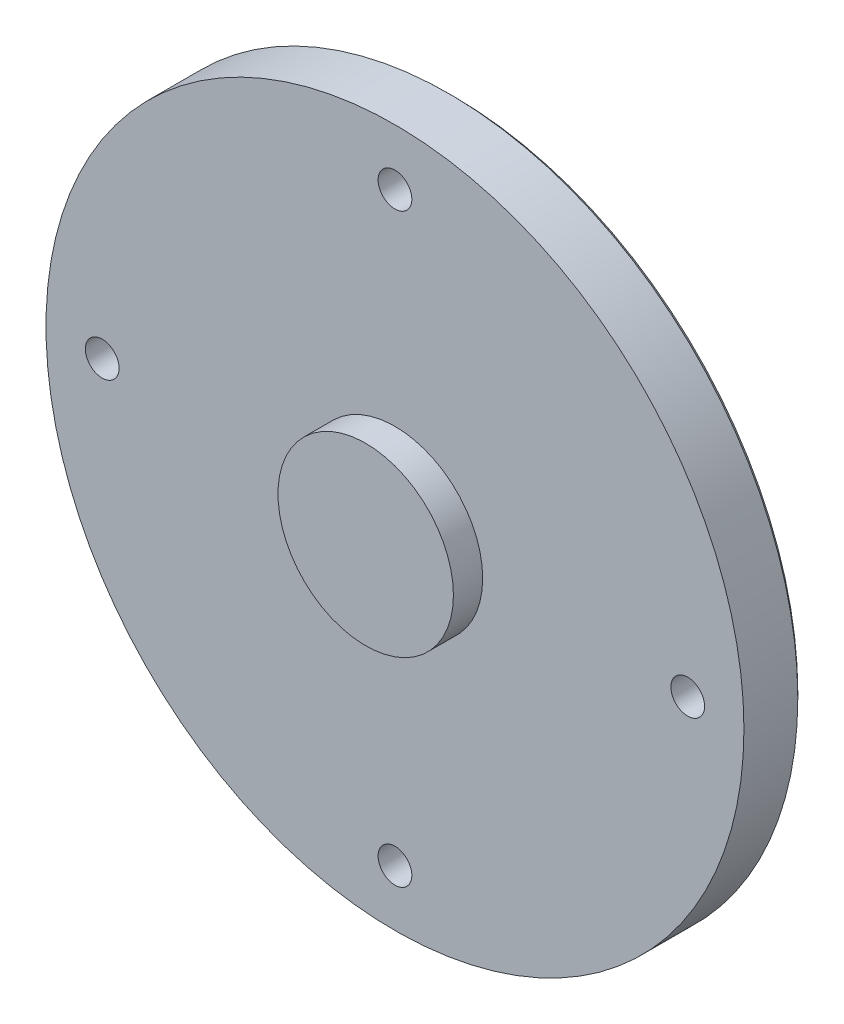
ISO-10303-21;
HEADER;
FILE_DESCRIPTION(('STEP AP214'),'2;1');
FILE_NAME('part.step','',(''),(''),'','','');
FILE_SCHEMA(('AUTOMOTIVE_DESIGN { 1 0 10303 214 1 1 1 1 }'));
ENDSEC;
DATA;
#1=APPLICATION_CONTEXT('core data for automotive mechanical design processes');
#2=APPLICATION_PROTOCOL_DEFINITION('international standard','automotive_design',2000,#1);
#3=PRODUCT_CONTEXT('',#1,'mechanical');
#4=PRODUCT('Part','Part','',(#3));
#5=PRODUCT_RELATED_PRODUCT_CATEGORY('part','',(#4));
#6=PRODUCT_DEFINITION_FORMATION('','',#4);
#7=PRODUCT_DEFINITION_CONTEXT('part definition',#1,'design');
#8=PRODUCT_DEFINITION('design','',#6,#7);
#9=PRODUCT_DEFINITION_SHAPE('','',#8);
#10=(LENGTH_UNIT() NAMED_UNIT(*) SI_UNIT(.MILLI.,.METRE.));
#11=(NAMED_UNIT(*) PLANE_ANGLE_UNIT() SI_UNIT($,.RADIAN.));
#12=(NAMED_UNIT(*) SI_UNIT($,.STERADIAN.) SOLID_ANGLE_UNIT());
#13=UNCERTAINTY_MEASURE_WITH_UNIT(LENGTH_MEASURE(1.E-05),#10,'distance_accuracy_value','');
#14=(GEOMETRIC_REPRESENTATION_CONTEXT(3) GLOBAL_UNCERTAINTY_ASSIGNED_CONTEXT((#13)) GLOBAL_UNIT_ASSIGNED_CONTEXT((#10,
#11,#12)) REPRESENTATION_CONTEXT('',''));
#15=CARTESIAN_POINT('',(0.,0.,0.));
#16=DIRECTION('',(0.,0.,1.));
#17=DIRECTION('',(1.,0.,0.));
#18=AXIS2_PLACEMENT_3D('',#15,#16,#17);
#19=CARTESIAN_POINT('',(0.,0.,22.225));
#20=DIRECTION('',(0.,0.,-1.));
#21=DIRECTION('',(-1.,0.,0.));
#22=AXIS2_PLACEMENT_3D('',#19,#20,#21);
#23=PLANE('',#22);
#24=CARTESIAN_POINT('',(0.,0.,22.225));
#25=DIRECTION('',(0.,0.,1.));
#26=DIRECTION('',(1.,0.,0.));
#27=AXIS2_PLACEMENT_3D('',#24,#25,#26);
#28=CIRCLE('',#27,9.5123);
#29=CARTESIAN_POINT('',(9.5123,0.,22.225));
#30=VERTEX_POINT('',#29);
#31=EDGE_CURVE('E70',#30,#30,#28,.T.);
#32=ORIENTED_EDGE('',*,*,#31,.T.);
#33=EDGE_LOOP('',(#32));
#34=FACE_BOUND('',#33,.T.);
#35=ADVANCED_FACE('F45',(#34),#23,.F.);
#36=CARTESIAN_POINT('',(0.,0.,22.225));
#37=DIRECTION('',(0.,0.,1.));
#38=DIRECTION('',(1.,0.,0.));
#39=AXIS2_PLACEMENT_3D('',#36,#37,#38);
#40=CYLINDRICAL_SURFACE('',#39,9.5123);
#41=ORIENTED_EDGE('',*,*,#31,.F.);
#42=EDGE_LOOP('',(#41));
#43=FACE_BOUND('',#42,.T.);
#44=CARTESIAN_POINT('',(0.,0.,19.05));
#45=DIRECTION('',(0.,0.,1.));
#46=DIRECTION('',(1.,0.,0.));
#47=AXIS2_PLACEMENT_3D('',#44,#45,#46);
#48=CIRCLE('',#47,9.5123);
#49=CARTESIAN_POINT('',(9.5123,0.,19.05));
#50=VERTEX_POINT('',#49);
#51=EDGE_CURVE('E98',#50,#50,#48,.T.);
#52=ORIENTED_EDGE('',*,*,#51,.T.);
#53=EDGE_LOOP('',(#52));
#54=FACE_BOUND('',#53,.T.);
#55=ADVANCED_FACE('F177',(#43,#54),#40,.T.);
#56=CARTESIAN_POINT('',(0.,9.5123,19.05));
#57=DIRECTION('',(0.,0.,-1.));
#58=DIRECTION('',(-1.,0.,0.));
#59=AXIS2_PLACEMENT_3D('',#56,#57,#58);
#60=PLANE('',#59);
#61=CARTESIAN_POINT('',(0.,31.75,19.05));
#62=DIRECTION('',(0.,0.,-1.));
#63=DIRECTION('',(-1.,0.,0.));
#64=AXIS2_PLACEMENT_3D('',#61,#62,#63);
#65=CIRCLE('',#64,1.8288);
#66=CARTESIAN_POINT('',(-1.8288,31.75,19.05));
#67=VERTEX_POINT('',#66);
#68=EDGE_CURVE('E71',#67,#67,#65,.T.);
#69=ORIENTED_EDGE('',*,*,#68,.T.);
#70=EDGE_LOOP('',(#69));
#71=FACE_BOUND('',#70,.T.);
#72=CARTESIAN_POINT('',(-31.75,0.,19.05));
#73=DIRECTION('',(0.,0.,-1.));
#74=DIRECTION('',(-1.,0.,0.));
#75=AXIS2_PLACEMENT_3D('',#72,#73,#74);
#76=CIRCLE('',#75,1.8288);
#77=CARTESIAN_POINT('',(-33.5788,0.,19.05));
#78=VERTEX_POINT('',#77);
#79=EDGE_CURVE('E77',#78,#78,#76,.T.);
#80=ORIENTED_EDGE('',*,*,#79,.T.);
#81=EDGE_LOOP('',(#80));
#82=FACE_BOUND('',#81,.T.);
#83=CARTESIAN_POINT('',(0.,-31.75,19.05));
#84=DIRECTION('',(0.,0.,-1.));
#85=DIRECTION('',(-1.,0.,0.));
#86=AXIS2_PLACEMENT_3D('',#83,#84,#85);
#87=CIRCLE('',#86,1.8288);
#88=CARTESIAN_POINT('',(-1.8288,-31.75,19.05));
#89=VERTEX_POINT('',#88);
#90=EDGE_CURVE('E83',#89,#89,#87,.T.);
#91=ORIENTED_EDGE('',*,*,#90,.T.);
#92=EDGE_LOOP('',(#91));
#93=FACE_BOUND('',#92,.T.);
#94=CARTESIAN_POINT('',(31.75,0.,19.05));
#95=DIRECTION('',(0.,0.,-1.));
#96=DIRECTION('',(-1.,0.,0.));
#97=AXIS2_PLACEMENT_3D('',#94,#95,#96);
#98=CIRCLE('',#97,1.8288);
#99=CARTESIAN_POINT('',(29.9212,0.,19.05));
#100=VERTEX_POINT('',#99);
#101=EDGE_CURVE('E89',#100,#100,#98,.T.);
#102=ORIENTED_EDGE('',*,*,#101,.T.);
#103=EDGE_LOOP('',(#102));
#104=FACE_BOUND('',#103,.T.);
#105=ORIENTED_EDGE('',*,*,#51,.F.);
#106=EDGE_LOOP('',(#105));
#107=FACE_BOUND('',#106,.T.);
#108=CARTESIAN_POINT('',(0.,0.,19.05));
#109=DIRECTION('',(0.,0.,1.));
#110=DIRECTION('',(1.,0.,0.));
#111=AXIS2_PLACEMENT_3D('',#108,#109,#110);
#112=CIRCLE('',#111,37.846);
#113=CARTESIAN_POINT('',(37.846,0.,19.05));
#114=VERTEX_POINT('',#113);
#115=EDGE_CURVE('E102',#114,#114,#112,.T.);
#116=ORIENTED_EDGE('',*,*,#115,.T.);
#117=EDGE_LOOP('',(#116));
#118=FACE_BOUND('',#117,.T.);
#119=ADVANCED_FACE('F183',(#71,#82,#93,#104,#107,#118),#60,.F.);
#120=CARTESIAN_POINT('',(0.,0.,22.225));
#121=DIRECTION('',(0.,0.,1.));
#122=DIRECTION('',(1.,0.,0.));
#123=AXIS2_PLACEMENT_3D('',#120,#121,#122);
#124=CYLINDRICAL_SURFACE('',#123,37.846);
#125=CARTESIAN_POINT('',(0.,0.,13.208));
#126=DIRECTION('',(0.,0.,1.));
#127=DIRECTION('',(1.,0.,0.));
#128=AXIS2_PLACEMENT_3D('',#125,#126,#127);
#129=CIRCLE('',#128,37.846);
#130=CARTESIAN_POINT('',(37.846,0.,13.208));
#131=VERTEX_POINT('',#130);
#132=EDGE_CURVE('E64',#131,#131,#129,.T.);
#133=ORIENTED_EDGE('',*,*,#132,.T.);
#134=EDGE_LOOP('',(#133));
#135=FACE_BOUND('',#134,.T.);
#136=ORIENTED_EDGE('',*,*,#115,.F.);
#137=EDGE_LOOP('',(#136));
#138=FACE_BOUND('',#137,.T.);
#139=ADVANCED_FACE('F157',(#135,#138),#124,.T.);
#140=CARTESIAN_POINT('',(0.,37.846,12.7));
#141=DIRECTION('',(0.,0.,1.));
#142=DIRECTION('',(1.,0.,0.));
#143=AXIS2_PLACEMENT_3D('',#140,#141,#142);
#144=PLANE('',#143);
#145=CARTESIAN_POINT('',(0.,0.,12.7));
#146=DIRECTION('',(0.,0.,1.));
#147=DIRECTION('',(1.,0.,0.));
#148=AXIS2_PLACEMENT_3D('',#145,#146,#147);
#149=CIRCLE('',#148,37.338);
#150=CARTESIAN_POINT('',(37.338,0.,12.7));
#151=VERTEX_POINT('',#150);
#152=EDGE_CURVE('E59',#151,#151,#149,.F.);
#153=ORIENTED_EDGE('',*,*,#152,.T.);
#154=EDGE_LOOP('',(#153));
#155=FACE_BOUND('',#154,.T.);
#156=CARTESIAN_POINT('',(0.,31.75,12.7));
#157=DIRECTION('',(0.,0.,-1.));
#158=DIRECTION('',(-1.,0.,0.));
#159=AXIS2_PLACEMENT_3D('',#156,#157,#158);
#160=CIRCLE('',#159,3.57251);
#161=CARTESIAN_POINT('',(-3.57251,31.75,12.7));
#162=VERTEX_POINT('',#161);
#163=EDGE_CURVE('E146',#162,#162,#160,.T.);
#164=ORIENTED_EDGE('',*,*,#163,.F.);
#165=EDGE_LOOP('',(#164));
#166=FACE_BOUND('',#165,.T.);
#167=CARTESIAN_POINT('',(-31.75,0.,12.7));
#168=DIRECTION('',(0.,0.,-1.));
#169=DIRECTION('',(-1.,0.,0.));
#170=AXIS2_PLACEMENT_3D('',#167,#168,#169);
#171=CIRCLE('',#170,3.57251);
#172=CARTESIAN_POINT('',(-35.32251,0.,12.7));
#173=VERTEX_POINT('',#172);
#174=EDGE_CURVE('E75',#173,#173,#171,.T.);
#175=ORIENTED_EDGE('',*,*,#174,.F.);
#176=EDGE_LOOP('',(#175));
#177=FACE_BOUND('',#176,.T.);
#178=CARTESIAN_POINT('',(0.,-31.75,12.7));
#179=DIRECTION('',(0.,0.,-1.));
#180=DIRECTION('',(-1.,0.,0.));
#181=AXIS2_PLACEMENT_3D('',#178,#179,#180);
#182=CIRCLE('',#181,3.57251);
#183=CARTESIAN_POINT('',(-3.57251,-31.75,12.7));
#184=VERTEX_POINT('',#183);
#185=EDGE_CURVE('E81',#184,#184,#182,.T.);
#186=ORIENTED_EDGE('',*,*,#185,.F.);
#187=EDGE_LOOP('',(#186));
#188=FACE_BOUND('',#187,.T.);
#189=CARTESIAN_POINT('',(31.75,0.,12.7));
#190=DIRECTION('',(0.,0.,-1.));
#191=DIRECTION('',(-1.,0.,0.));
#192=AXIS2_PLACEMENT_3D('',#189,#190,#191);
#193=CIRCLE('',#192,3.57251);
#194=CARTESIAN_POINT('',(28.17749,0.,12.7));
#195=VERTEX_POINT('',#194);
#196=EDGE_CURVE('E87',#195,#195,#193,.T.);
#197=ORIENTED_EDGE('',*,*,#196,.F.);
#198=EDGE_LOOP('',(#197));
#199=FACE_BOUND('',#198,.T.);
#200=CARTESIAN_POINT('',(0.,0.,12.7));
#201=DIRECTION('',(0.,0.,1.));
#202=DIRECTION('',(1.,0.,0.));
#203=AXIS2_PLACEMENT_3D('',#200,#201,#202);
#204=CIRCLE('',#203,12.6492);
#205=CARTESIAN_POINT('',(12.6492,0.,12.7));
#206=VERTEX_POINT('',#205);
#207=EDGE_CURVE('E93',#206,#206,#204,.T.);
#208=ORIENTED_EDGE('',*,*,#207,.T.);
#209=EDGE_LOOP('',(#208));
#210=FACE_BOUND('',#209,.T.);
#211=ADVANCED_FACE('F153',(#155,#166,#177,#188,#199,#210),#144,.F.);
#212=CARTESIAN_POINT('',(0.,0.,22.225));
#213=DIRECTION('',(0.,0.,1.));
#214=DIRECTION('',(1.,0.,0.));
#215=AXIS2_PLACEMENT_3D('',#212,#213,#214);
#216=CYLINDRICAL_SURFACE('',#215,12.6492);
#217=CARTESIAN_POINT('',(0.,0.,0.508000000000005));
#218=DIRECTION('',(0.,0.,1.));
#219=DIRECTION('',(1.,0.,0.));
#220=AXIS2_PLACEMENT_3D('',#217,#218,#219);
#221=CIRCLE('',#220,12.6492);
#222=CARTESIAN_POINT('',(12.6492,0.,0.508000000000005));
#223=VERTEX_POINT('',#222);
#224=EDGE_CURVE('E54',#223,#223,#221,.T.);
#225=ORIENTED_EDGE('',*,*,#224,.T.);
#226=EDGE_LOOP('',(#225));
#227=FACE_BOUND('',#226,.T.);
#228=ORIENTED_EDGE('',*,*,#207,.F.);
#229=EDGE_LOOP('',(#228));
#230=FACE_BOUND('',#229,.T.);
#231=ADVANCED_FACE('F156',(#227,#230),#216,.T.);
#232=CARTESIAN_POINT('',(0.,12.6492,0.));
#233=DIRECTION('',(0.,0.,1.));
#234=DIRECTION('',(1.,0.,0.));
#235=AXIS2_PLACEMENT_3D('',#232,#233,#234);
#236=PLANE('',#235);
#237=CARTESIAN_POINT('',(0.,0.,0.));
#238=DIRECTION('',(0.,0.,1.));
#239=DIRECTION('',(1.,0.,0.));
#240=AXIS2_PLACEMENT_3D('',#237,#238,#239);
#241=CIRCLE('',#240,12.1412);
#242=CARTESIAN_POINT('',(12.1412,0.,0.));
#243=VERTEX_POINT('',#242);
#244=EDGE_CURVE('E10',#243,#243,#241,.F.);
#245=ORIENTED_EDGE('',*,*,#244,.T.);
#246=EDGE_LOOP('',(#245));
#247=FACE_BOUND('',#246,.T.);
#248=ADVANCED_FACE('F169',(#247),#236,.F.);
#249=CARTESIAN_POINT('',(31.75,0.,12.7));
#250=DIRECTION('',(0.,0.,-1.));
#251=DIRECTION('',(-1.,0.,0.));
#252=AXIS2_PLACEMENT_3D('',#249,#250,#251);
#253=CYLINDRICAL_SURFACE('',#252,1.8288);
#254=CARTESIAN_POINT('',(31.75,0.,16.2052));
#255=DIRECTION('',(0.,0.,-1.));
#256=DIRECTION('',(-1.,0.,0.));
#257=AXIS2_PLACEMENT_3D('',#254,#255,#256);
#258=CIRCLE('',#257,1.8288);
#259=CARTESIAN_POINT('',(29.9212,0.,16.2052));
#260=VERTEX_POINT('',#259);
#261=EDGE_CURVE('E94',#260,#260,#258,.T.);
#262=ORIENTED_EDGE('',*,*,#261,.T.);
#263=EDGE_LOOP('',(#262));
#264=FACE_BOUND('',#263,.T.);
#265=ORIENTED_EDGE('',*,*,#101,.F.);
#266=EDGE_LOOP('',(#265));
#267=FACE_BOUND('',#266,.T.);
#268=ADVANCED_FACE('F174',(#264,#267),#253,.F.);
#269=CARTESIAN_POINT('',(33.5788,0.,16.2052));
#270=DIRECTION('',(0.,0.,1.));
#271=DIRECTION('',(1.,0.,0.));
#272=AXIS2_PLACEMENT_3D('',#269,#270,#271);
#273=PLANE('',#272);
#274=ORIENTED_EDGE('',*,*,#261,.F.);
#275=EDGE_LOOP('',(#274));
#276=FACE_BOUND('',#275,.T.);
#277=CARTESIAN_POINT('',(31.75,0.,16.2052));
#278=DIRECTION('',(0.,0.,-1.));
#279=DIRECTION('',(-1.,0.,0.));
#280=AXIS2_PLACEMENT_3D('',#277,#278,#279);
#281=CIRCLE('',#280,3.57251);
#282=CARTESIAN_POINT('',(28.17749,0.,16.2052));
#283=VERTEX_POINT('',#282);
#284=EDGE_CURVE('E112',#283,#283,#281,.T.);
#285=ORIENTED_EDGE('',*,*,#284,.T.);
#286=EDGE_LOOP('',(#285));
#287=FACE_BOUND('',#286,.T.);
#288=ADVANCED_FACE('F226',(#276,#287),#273,.F.);
#289=CARTESIAN_POINT('',(31.75,0.,12.7));
#290=DIRECTION('',(0.,0.,-1.));
#291=DIRECTION('',(-1.,0.,0.));
#292=AXIS2_PLACEMENT_3D('',#289,#290,#291);
#293=CYLINDRICAL_SURFACE('',#292,3.57251);
#294=ORIENTED_EDGE('',*,*,#284,.F.);
#295=EDGE_LOOP('',(#294));
#296=FACE_BOUND('',#295,.T.);
#297=ORIENTED_EDGE('',*,*,#196,.T.);
#298=EDGE_LOOP('',(#297));
#299=FACE_BOUND('',#298,.T.);
#300=ADVANCED_FACE('F232',(#296,#299),#293,.F.);
#301=CARTESIAN_POINT('',(0.,-31.75,12.7));
#302=DIRECTION('',(0.,0.,-1.));
#303=DIRECTION('',(-1.,0.,0.));
#304=AXIS2_PLACEMENT_3D('',#301,#302,#303);
#305=CYLINDRICAL_SURFACE('',#304,1.8288);
#306=CARTESIAN_POINT('',(0.,-31.75,16.2052));
#307=DIRECTION('',(0.,0.,-1.));
#308=DIRECTION('',(-1.,0.,0.));
#309=AXIS2_PLACEMENT_3D('',#306,#307,#308);
#310=CIRCLE('',#309,1.8288);
#311=CARTESIAN_POINT('',(-1.8288,-31.75,16.2052));
#312=VERTEX_POINT('',#311);
#313=EDGE_CURVE('E88',#312,#312,#310,.T.);
#314=ORIENTED_EDGE('',*,*,#313,.T.);
#315=EDGE_LOOP('',(#314));
#316=FACE_BOUND('',#315,.T.);
#317=ORIENTED_EDGE('',*,*,#90,.F.);
#318=EDGE_LOOP('',(#317));
#319=FACE_BOUND('',#318,.T.);
#320=ADVANCED_FACE('F238',(#316,#319),#305,.F.);
#321=CARTESIAN_POINT('',(1.8288,-31.75,16.2052));
#322=DIRECTION('',(0.,0.,1.));
#323=DIRECTION('',(1.,0.,0.));
#324=AXIS2_PLACEMENT_3D('',#321,#322,#323);
#325=PLANE('',#324);
#326=ORIENTED_EDGE('',*,*,#313,.F.);
#327=EDGE_LOOP('',(#326));
#328=FACE_BOUND('',#327,.T.);
#329=CARTESIAN_POINT('',(0.,-31.75,16.2052));
#330=DIRECTION('',(0.,0.,-1.));
#331=DIRECTION('',(-1.,0.,0.));
#332=AXIS2_PLACEMENT_3D('',#329,#330,#331);
#333=CIRCLE('',#332,3.57251);
#334=CARTESIAN_POINT('',(-3.57251,-31.75,16.2052));
#335=VERTEX_POINT('',#334);
#336=EDGE_CURVE('E122',#335,#335,#333,.T.);
#337=ORIENTED_EDGE('',*,*,#336,.T.);
#338=EDGE_LOOP('',(#337));
#339=FACE_BOUND('',#338,.T.);
#340=ADVANCED_FACE('F242',(#328,#339),#325,.F.);
#341=CARTESIAN_POINT('',(0.,-31.75,12.7));
#342=DIRECTION('',(0.,0.,-1.));
#343=DIRECTION('',(-1.,0.,0.));
#344=AXIS2_PLACEMENT_3D('',#341,#342,#343);
#345=CYLINDRICAL_SURFACE('',#344,3.57251);
#346=ORIENTED_EDGE('',*,*,#336,.F.);
#347=EDGE_LOOP('',(#346));
#348=FACE_BOUND('',#347,.T.);
#349=ORIENTED_EDGE('',*,*,#185,.T.);
#350=EDGE_LOOP('',(#349));
#351=FACE_BOUND('',#350,.T.);
#352=ADVANCED_FACE('F246',(#348,#351),#345,.F.);
#353=CARTESIAN_POINT('',(-31.75,0.,12.7));
#354=DIRECTION('',(0.,0.,-1.));
#355=DIRECTION('',(-1.,0.,0.));
#356=AXIS2_PLACEMENT_3D('',#353,#354,#355);
#357=CYLINDRICAL_SURFACE('',#356,1.8288);
#358=CARTESIAN_POINT('',(-31.75,0.,16.2052));
#359=DIRECTION('',(0.,0.,-1.));
#360=DIRECTION('',(-1.,0.,0.));
#361=AXIS2_PLACEMENT_3D('',#358,#359,#360);
#362=CIRCLE('',#361,1.8288);
#363=CARTESIAN_POINT('',(-33.5788,0.,16.2052));
#364=VERTEX_POINT('',#363);
#365=EDGE_CURVE('E82',#364,#364,#362,.T.);
#366=ORIENTED_EDGE('',*,*,#365,.T.);
#367=EDGE_LOOP('',(#366));
#368=FACE_BOUND('',#367,.T.);
#369=ORIENTED_EDGE('',*,*,#79,.F.);
#370=EDGE_LOOP('',(#369));
#371=FACE_BOUND('',#370,.T.);
#372=ADVANCED_FACE('F250',(#368,#371),#357,.F.);
#373=CARTESIAN_POINT('',(-29.9212,0.,16.2052));
#374=DIRECTION('',(0.,0.,1.));
#375=DIRECTION('',(1.,0.,0.));
#376=AXIS2_PLACEMENT_3D('',#373,#374,#375);
#377=PLANE('',#376);
#378=ORIENTED_EDGE('',*,*,#365,.F.);
#379=EDGE_LOOP('',(#378));
#380=FACE_BOUND('',#379,.T.);
#381=CARTESIAN_POINT('',(-31.75,0.,16.2052));
#382=DIRECTION('',(0.,0.,-1.));
#383=DIRECTION('',(-1.,0.,0.));
#384=AXIS2_PLACEMENT_3D('',#381,#382,#383);
#385=CIRCLE('',#384,3.57251);
#386=CARTESIAN_POINT('',(-35.32251,0.,16.2052));
#387=VERTEX_POINT('',#386);
#388=EDGE_CURVE('E132',#387,#387,#385,.T.);
#389=ORIENTED_EDGE('',*,*,#388,.T.);
#390=EDGE_LOOP('',(#389));
#391=FACE_BOUND('',#390,.T.);
#392=ADVANCED_FACE('F254',(#380,#391),#377,.F.);
#393=CARTESIAN_POINT('',(-31.75,0.,12.7));
#394=DIRECTION('',(0.,0.,-1.));
#395=DIRECTION('',(-1.,0.,0.));
#396=AXIS2_PLACEMENT_3D('',#393,#394,#395);
#397=CYLINDRICAL_SURFACE('',#396,3.57251);
#398=ORIENTED_EDGE('',*,*,#388,.F.);
#399=EDGE_LOOP('',(#398));
#400=FACE_BOUND('',#399,.T.);
#401=ORIENTED_EDGE('',*,*,#174,.T.);
#402=EDGE_LOOP('',(#401));
#403=FACE_BOUND('',#402,.T.);
#404=ADVANCED_FACE('F258',(#400,#403),#397,.F.);
#405=CARTESIAN_POINT('',(0.,31.75,12.7));
#406=DIRECTION('',(0.,0.,-1.));
#407=DIRECTION('',(-1.,0.,0.));
#408=AXIS2_PLACEMENT_3D('',#405,#406,#407);
#409=CYLINDRICAL_SURFACE('',#408,1.8288);
#410=CARTESIAN_POINT('',(0.,31.75,16.2052));
#411=DIRECTION('',(0.,0.,-1.));
#412=DIRECTION('',(-1.,0.,0.));
#413=AXIS2_PLACEMENT_3D('',#410,#411,#412);
#414=CIRCLE('',#413,1.8288);
#415=CARTESIAN_POINT('',(-1.8288,31.75,16.2052));
#416=VERTEX_POINT('',#415);
#417=EDGE_CURVE('E76',#416,#416,#414,.T.);
#418=ORIENTED_EDGE('',*,*,#417,.T.);
#419=EDGE_LOOP('',(#418));
#420=FACE_BOUND('',#419,.T.);
#421=ORIENTED_EDGE('',*,*,#68,.F.);
#422=EDGE_LOOP('',(#421));
#423=FACE_BOUND('',#422,.T.);
#424=ADVANCED_FACE('F262',(#420,#423),#409,.F.);
#425=CARTESIAN_POINT('',(1.8288,31.75,16.2052));
#426=DIRECTION('',(0.,0.,1.));
#427=DIRECTION('',(1.,0.,0.));
#428=AXIS2_PLACEMENT_3D('',#425,#426,#427);
#429=PLANE('',#428);
#430=ORIENTED_EDGE('',*,*,#417,.F.);
#431=EDGE_LOOP('',(#430));
#432=FACE_BOUND('',#431,.T.);
#433=CARTESIAN_POINT('',(0.,31.75,16.2052));
#434=DIRECTION('',(0.,0.,-1.));
#435=DIRECTION('',(-1.,0.,0.));
#436=AXIS2_PLACEMENT_3D('',#433,#434,#435);
#437=CIRCLE('',#436,3.57251);
#438=CARTESIAN_POINT('',(-3.57251,31.75,16.2052));
#439=VERTEX_POINT('',#438);
#440=EDGE_CURVE('E142',#439,#439,#437,.T.);
#441=ORIENTED_EDGE('',*,*,#440,.T.);
#442=EDGE_LOOP('',(#441));
#443=FACE_BOUND('',#442,.T.);
#444=ADVANCED_FACE('F198',(#432,#443),#429,.F.);
#445=CARTESIAN_POINT('',(0.,31.75,12.7));
#446=DIRECTION('',(0.,0.,-1.));
#447=DIRECTION('',(-1.,0.,0.));
#448=AXIS2_PLACEMENT_3D('',#445,#446,#447);
#449=CYLINDRICAL_SURFACE('',#448,3.57251);
#450=ORIENTED_EDGE('',*,*,#440,.F.);
#451=EDGE_LOOP('',(#450));
#452=FACE_BOUND('',#451,.T.);
#453=ORIENTED_EDGE('',*,*,#163,.T.);
#454=EDGE_LOOP('',(#453));
#455=FACE_BOUND('',#454,.T.);
#456=ADVANCED_FACE('F151',(#452,#455),#449,.F.);
#457=CARTESIAN_POINT('',(0.,0.,13.208));
#458=DIRECTION('',(0.,0.,1.));
#459=DIRECTION('',(1.,0.,0.));
#460=AXIS2_PLACEMENT_3D('',#457,#458,#459);
#461=CONICAL_SURFACE('',#460,37.846,0.785398163397455);
#462=ORIENTED_EDGE('',*,*,#152,.F.);
#463=EDGE_LOOP('',(#462));
#464=FACE_BOUND('',#463,.T.);
#465=ORIENTED_EDGE('',*,*,#132,.F.);
#466=EDGE_LOOP('',(#465));
#467=FACE_BOUND('',#466,.T.);
#468=ADVANCED_FACE('F188',(#464,#467),#461,.T.);
#469=CARTESIAN_POINT('',(0.,0.,0.508000000000005));
#470=DIRECTION('',(0.,0.,1.));
#471=DIRECTION('',(1.,0.,0.));
#472=AXIS2_PLACEMENT_3D('',#469,#470,#471);
#473=CONICAL_SURFACE('',#472,12.6492,0.785398163397453);
#474=ORIENTED_EDGE('',*,*,#244,.F.);
#475=EDGE_LOOP('',(#474));
#476=FACE_BOUND('',#475,.T.);
#477=ORIENTED_EDGE('',*,*,#224,.F.);
#478=EDGE_LOOP('',(#477));
#479=FACE_BOUND('',#478,.T.);
#480=ADVANCED_FACE('F48',(#476,#479),#473,.T.);
#481=CLOSED_SHELL('',(#35,#55,#119,#139,#211,#231,#248,#268,#288,#300,#320,#340,#352,#372,#392,
#404,#424,#444,#456,#468,#480));
#482=MANIFOLD_SOLID_BREP('B2',#481);
#483=ADVANCED_BREP_SHAPE_REPRESENTATION('',(#18,#482),#14);
#484=SHAPE_DEFINITION_REPRESENTATION(#9,#483);
ENDSEC;
END-ISO-10303-21;
